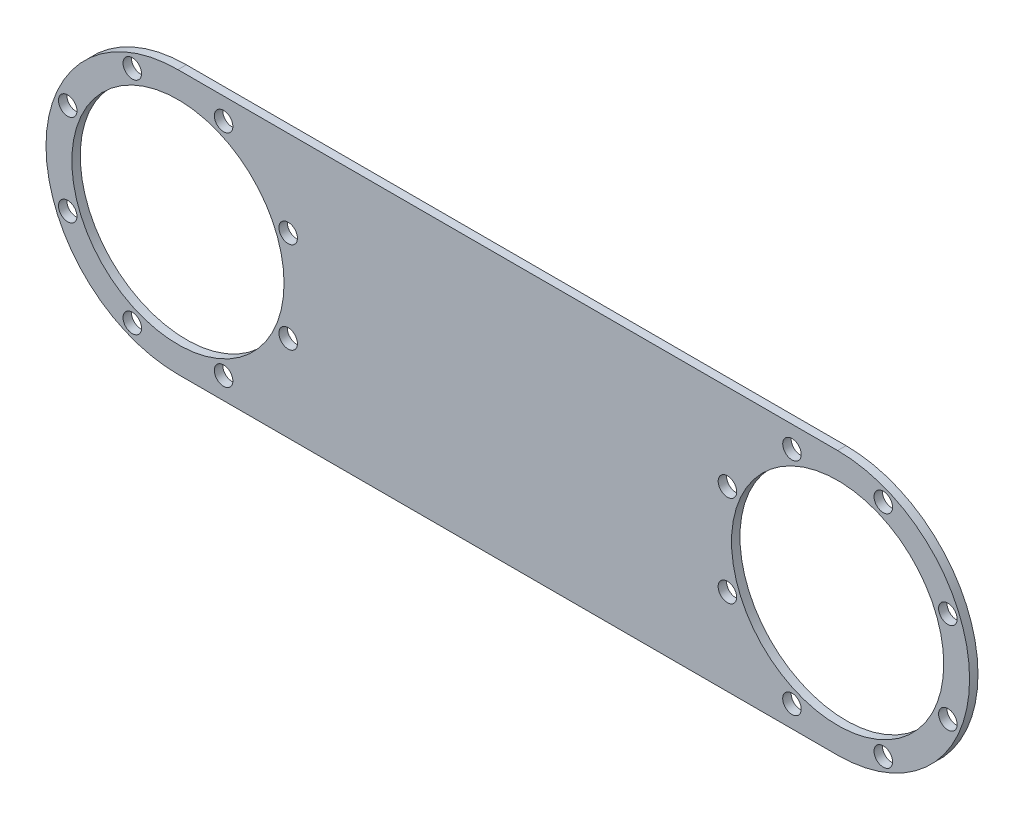
ISO-10303-21;
HEADER;
FILE_DESCRIPTION(('STEP AP214'),'2;1');
FILE_NAME('part.step','',(''),(''),'','','');
FILE_SCHEMA(('AUTOMOTIVE_DESIGN { 1 0 10303 214 1 1 1 1 }'));
ENDSEC;
DATA;
#1=APPLICATION_CONTEXT('core data for automotive mechanical design processes');
#2=APPLICATION_PROTOCOL_DEFINITION('international standard','automotive_design',2000,#1);
#3=PRODUCT_CONTEXT('',#1,'mechanical');
#4=PRODUCT('Part','Part','',(#3));
#5=PRODUCT_RELATED_PRODUCT_CATEGORY('part','',(#4));
#6=PRODUCT_DEFINITION_FORMATION('','',#4);
#7=PRODUCT_DEFINITION_CONTEXT('part definition',#1,'design');
#8=PRODUCT_DEFINITION('design','',#6,#7);
#9=PRODUCT_DEFINITION_SHAPE('','',#8);
#10=(LENGTH_UNIT() NAMED_UNIT(*) SI_UNIT(.MILLI.,.METRE.));
#11=(NAMED_UNIT(*) PLANE_ANGLE_UNIT() SI_UNIT($,.RADIAN.));
#12=(NAMED_UNIT(*) SI_UNIT($,.STERADIAN.) SOLID_ANGLE_UNIT());
#13=UNCERTAINTY_MEASURE_WITH_UNIT(LENGTH_MEASURE(1.E-05),#10,'distance_accuracy_value','');
#14=(GEOMETRIC_REPRESENTATION_CONTEXT(3) GLOBAL_UNCERTAINTY_ASSIGNED_CONTEXT((#13)) GLOBAL_UNIT_ASSIGNED_CONTEXT((#10,
#11,#12)) REPRESENTATION_CONTEXT('',''));
#15=CARTESIAN_POINT('',(0.,0.,0.));
#16=DIRECTION('',(0.,0.,1.));
#17=DIRECTION('',(1.,0.,0.));
#18=AXIS2_PLACEMENT_3D('',#15,#16,#17);
#19=CARTESIAN_POINT('',(0.,0.,3.));
#20=DIRECTION('',(0.,0.,-1.));
#21=DIRECTION('',(-1.,0.,0.));
#22=AXIS2_PLACEMENT_3D('',#19,#20,#21);
#23=PLANE('',#22);
#24=CARTESIAN_POINT('',(0.,0.,3.));
#25=DIRECTION('',(0.,0.,1.));
#26=DIRECTION('',(-1.,0.,0.));
#27=AXIS2_PLACEMENT_3D('',#24,#25,#26);
#28=CIRCLE('',#27,47.);
#29=CARTESIAN_POINT('',(0.,47.,3.));
#30=VERTEX_POINT('',#29);
#31=CARTESIAN_POINT('',(0.,-47.,3.));
#32=VERTEX_POINT('',#31);
#33=EDGE_CURVE('E87',#30,#32,#28,.T.);
#34=ORIENTED_EDGE('',*,*,#33,.T.);
#35=DIRECTION('',(1.,0.,0.));
#36=VECTOR('',#35,1.);
#37=CARTESIAN_POINT('',(0.,-47.,3.));
#38=LINE('',#37,#36);
#39=CARTESIAN_POINT('',(235.,-46.9999999999999,3.));
#40=VERTEX_POINT('',#39);
#41=EDGE_CURVE('E82',#32,#40,#38,.T.);
#42=ORIENTED_EDGE('',*,*,#41,.T.);
#43=CARTESIAN_POINT('',(235.,-1.55431223447522E-12,3.));
#44=DIRECTION('',(0.,0.,1.));
#45=DIRECTION('',(1.,0.,0.));
#46=AXIS2_PLACEMENT_3D('',#43,#44,#45);
#47=CIRCLE('',#46,47.);
#48=CARTESIAN_POINT('',(235.,46.9999999999984,3.));
#49=VERTEX_POINT('',#48);
#50=EDGE_CURVE('E85',#40,#49,#47,.T.);
#51=ORIENTED_EDGE('',*,*,#50,.T.);
#52=DIRECTION('',(-1.,0.,0.));
#53=VECTOR('',#52,1.);
#54=CARTESIAN_POINT('',(0.,47.,3.));
#55=LINE('',#54,#53);
#56=EDGE_CURVE('E52',#49,#30,#55,.T.);
#57=ORIENTED_EDGE('',*,*,#56,.T.);
#58=EDGE_LOOP('',(#34,#42,#51,#57));
#59=FACE_BOUND('',#58,.T.);
#60=CARTESIAN_POINT('',(0.,0.,3.));
#61=DIRECTION('',(0.,0.,1.));
#62=DIRECTION('',(1.,0.,0.));
#63=AXIS2_PLACEMENT_3D('',#60,#61,#62);
#64=CIRCLE('',#63,37.8);
#65=CARTESIAN_POINT('',(37.8,0.,3.));
#66=VERTEX_POINT('',#65);
#67=EDGE_CURVE('E102',#66,#66,#64,.T.);
#68=ORIENTED_EDGE('',*,*,#67,.F.);
#69=EDGE_LOOP('',(#68));
#70=FACE_BOUND('',#69,.T.);
#71=CARTESIAN_POINT('',(235.,-1.55431223447522E-12,3.));
#72=DIRECTION('',(0.,0.,1.));
#73=DIRECTION('',(1.,0.,0.));
#74=AXIS2_PLACEMENT_3D('',#71,#72,#73);
#75=CIRCLE('',#74,37.8);
#76=CARTESIAN_POINT('',(272.8,-1.55431223447522E-12,3.));
#77=VERTEX_POINT('',#76);
#78=EDGE_CURVE('E117',#77,#77,#75,.T.);
#79=ORIENTED_EDGE('',*,*,#78,.F.);
#80=EDGE_LOOP('',(#79));
#81=FACE_BOUND('',#80,.T.);
#82=CARTESIAN_POINT('',(16.2640458755164,-39.2648801317297,3.));
#83=DIRECTION('',(0.,0.,1.));
#84=DIRECTION('',(1.,0.,0.));
#85=AXIS2_PLACEMENT_3D('',#82,#83,#84);
#86=CIRCLE('',#85,3.30000000000001);
#87=CARTESIAN_POINT('',(19.5640458755164,-39.2648801317297,3.));
#88=VERTEX_POINT('',#87);
#89=EDGE_CURVE('E123',#88,#88,#86,.T.);
#90=ORIENTED_EDGE('',*,*,#89,.F.);
#91=EDGE_LOOP('',(#90));
#92=FACE_BOUND('',#91,.T.);
#93=CARTESIAN_POINT('',(39.2648801317298,-16.2640458755163,3.));
#94=DIRECTION('',(0.,0.,1.));
#95=DIRECTION('',(1.,0.,0.));
#96=AXIS2_PLACEMENT_3D('',#93,#94,#95);
#97=CIRCLE('',#96,3.3);
#98=CARTESIAN_POINT('',(42.5648801317298,-16.2640458755163,3.));
#99=VERTEX_POINT('',#98);
#100=EDGE_CURVE('E129',#99,#99,#97,.T.);
#101=ORIENTED_EDGE('',*,*,#100,.F.);
#102=EDGE_LOOP('',(#101));
#103=FACE_BOUND('',#102,.T.);
#104=CARTESIAN_POINT('',(39.2648801317297,16.2640458755163,3.));
#105=DIRECTION('',(0.,0.,1.));
#106=DIRECTION('',(1.,0.,0.));
#107=AXIS2_PLACEMENT_3D('',#104,#105,#106);
#108=CIRCLE('',#107,3.3);
#109=CARTESIAN_POINT('',(42.5648801317297,16.2640458755163,3.));
#110=VERTEX_POINT('',#109);
#111=EDGE_CURVE('E135',#110,#110,#108,.T.);
#112=ORIENTED_EDGE('',*,*,#111,.F.);
#113=EDGE_LOOP('',(#112));
#114=FACE_BOUND('',#113,.T.);
#115=CARTESIAN_POINT('',(16.2640458755164,39.2648801317297,3.));
#116=DIRECTION('',(0.,0.,1.));
#117=DIRECTION('',(1.,0.,0.));
#118=AXIS2_PLACEMENT_3D('',#115,#116,#117);
#119=CIRCLE('',#118,3.30000000000001);
#120=CARTESIAN_POINT('',(19.5640458755164,39.2648801317297,3.));
#121=VERTEX_POINT('',#120);
#122=EDGE_CURVE('E141',#121,#121,#119,.T.);
#123=ORIENTED_EDGE('',*,*,#122,.F.);
#124=EDGE_LOOP('',(#123));
#125=FACE_BOUND('',#124,.T.);
#126=CARTESIAN_POINT('',(-16.2640458755163,39.2648801317297,3.));
#127=DIRECTION('',(0.,0.,1.));
#128=DIRECTION('',(1.,0.,0.));
#129=AXIS2_PLACEMENT_3D('',#126,#127,#128);
#130=CIRCLE('',#129,3.3);
#131=CARTESIAN_POINT('',(-12.9640458755163,39.2648801317297,3.));
#132=VERTEX_POINT('',#131);
#133=EDGE_CURVE('E147',#132,#132,#130,.T.);
#134=ORIENTED_EDGE('',*,*,#133,.F.);
#135=EDGE_LOOP('',(#134));
#136=FACE_BOUND('',#135,.T.);
#137=CARTESIAN_POINT('',(-39.2648801317296,16.2640458755163,3.));
#138=DIRECTION('',(0.,0.,1.));
#139=DIRECTION('',(1.,0.,0.));
#140=AXIS2_PLACEMENT_3D('',#137,#138,#139);
#141=CIRCLE('',#140,3.3);
#142=CARTESIAN_POINT('',(-35.9648801317296,16.2640458755163,3.));
#143=VERTEX_POINT('',#142);
#144=EDGE_CURVE('E153',#143,#143,#141,.T.);
#145=ORIENTED_EDGE('',*,*,#144,.F.);
#146=EDGE_LOOP('',(#145));
#147=FACE_BOUND('',#146,.T.);
#148=CARTESIAN_POINT('',(-39.2648801317296,-16.2640458755163,3.));
#149=DIRECTION('',(0.,0.,1.));
#150=DIRECTION('',(1.,0.,0.));
#151=AXIS2_PLACEMENT_3D('',#148,#149,#150);
#152=CIRCLE('',#151,3.3);
#153=CARTESIAN_POINT('',(-35.9648801317296,-16.2640458755163,3.));
#154=VERTEX_POINT('',#153);
#155=EDGE_CURVE('E159',#154,#154,#152,.T.);
#156=ORIENTED_EDGE('',*,*,#155,.F.);
#157=EDGE_LOOP('',(#156));
#158=FACE_BOUND('',#157,.T.);
#159=CARTESIAN_POINT('',(-16.2640458755163,-39.2648801317297,3.));
#160=DIRECTION('',(0.,0.,1.));
#161=DIRECTION('',(1.,0.,0.));
#162=AXIS2_PLACEMENT_3D('',#159,#160,#161);
#163=CIRCLE('',#162,3.3);
#164=CARTESIAN_POINT('',(-12.9640458755163,-39.2648801317297,3.));
#165=VERTEX_POINT('',#164);
#166=EDGE_CURVE('E165',#165,#165,#163,.T.);
#167=ORIENTED_EDGE('',*,*,#166,.F.);
#168=EDGE_LOOP('',(#167));
#169=FACE_BOUND('',#168,.T.);
#170=CARTESIAN_POINT('',(251.264045875516,-39.2648801317296,3.));
#171=DIRECTION('',(0.,0.,1.));
#172=DIRECTION('',(1.,0.,0.));
#173=AXIS2_PLACEMENT_3D('',#170,#171,#172);
#174=CIRCLE('',#173,3.29999999999997);
#175=CARTESIAN_POINT('',(254.564045875516,-39.2648801317296,3.));
#176=VERTEX_POINT('',#175);
#177=EDGE_CURVE('E171',#176,#176,#174,.T.);
#178=ORIENTED_EDGE('',*,*,#177,.F.);
#179=EDGE_LOOP('',(#178));
#180=FACE_BOUND('',#179,.T.);
#181=CARTESIAN_POINT('',(274.26488013173,-16.2640458755163,3.));
#182=DIRECTION('',(0.,0.,1.));
#183=DIRECTION('',(1.,0.,0.));
#184=AXIS2_PLACEMENT_3D('',#181,#182,#183);
#185=CIRCLE('',#184,3.29999999999998);
#186=CARTESIAN_POINT('',(277.56488013173,-16.2640458755163,3.));
#187=VERTEX_POINT('',#186);
#188=EDGE_CURVE('E177',#187,#187,#185,.T.);
#189=ORIENTED_EDGE('',*,*,#188,.F.);
#190=EDGE_LOOP('',(#189));
#191=FACE_BOUND('',#190,.T.);
#192=CARTESIAN_POINT('',(274.26488013173,16.2640458755164,3.));
#193=DIRECTION('',(0.,0.,1.));
#194=DIRECTION('',(1.,0.,0.));
#195=AXIS2_PLACEMENT_3D('',#192,#193,#194);
#196=CIRCLE('',#195,3.29999999999997);
#197=CARTESIAN_POINT('',(277.56488013173,16.2640458755164,3.));
#198=VERTEX_POINT('',#197);
#199=EDGE_CURVE('E183',#198,#198,#196,.T.);
#200=ORIENTED_EDGE('',*,*,#199,.F.);
#201=EDGE_LOOP('',(#200));
#202=FACE_BOUND('',#201,.T.);
#203=CARTESIAN_POINT('',(251.264045875516,39.2648801317297,3.));
#204=DIRECTION('',(0.,0.,1.));
#205=DIRECTION('',(1.,0.,0.));
#206=AXIS2_PLACEMENT_3D('',#203,#204,#205);
#207=CIRCLE('',#206,3.29999999999997);
#208=CARTESIAN_POINT('',(254.564045875516,39.2648801317297,3.));
#209=VERTEX_POINT('',#208);
#210=EDGE_CURVE('E189',#209,#209,#207,.T.);
#211=ORIENTED_EDGE('',*,*,#210,.F.);
#212=EDGE_LOOP('',(#211));
#213=FACE_BOUND('',#212,.T.);
#214=CARTESIAN_POINT('',(218.735954124484,39.2648801317297,3.));
#215=DIRECTION('',(0.,0.,1.));
#216=DIRECTION('',(1.,0.,0.));
#217=AXIS2_PLACEMENT_3D('',#214,#215,#216);
#218=CIRCLE('',#217,3.3);
#219=CARTESIAN_POINT('',(222.035954124484,39.2648801317297,3.));
#220=VERTEX_POINT('',#219);
#221=EDGE_CURVE('E195',#220,#220,#218,.T.);
#222=ORIENTED_EDGE('',*,*,#221,.F.);
#223=EDGE_LOOP('',(#222));
#224=FACE_BOUND('',#223,.T.);
#225=CARTESIAN_POINT('',(195.73511986827,16.2640458755164,3.));
#226=DIRECTION('',(0.,0.,1.));
#227=DIRECTION('',(1.,0.,0.));
#228=AXIS2_PLACEMENT_3D('',#225,#226,#227);
#229=CIRCLE('',#228,3.3);
#230=CARTESIAN_POINT('',(199.03511986827,16.2640458755164,3.));
#231=VERTEX_POINT('',#230);
#232=EDGE_CURVE('E201',#231,#231,#229,.T.);
#233=ORIENTED_EDGE('',*,*,#232,.F.);
#234=EDGE_LOOP('',(#233));
#235=FACE_BOUND('',#234,.T.);
#236=CARTESIAN_POINT('',(195.73511986827,-16.2640458755163,3.));
#237=DIRECTION('',(0.,0.,1.));
#238=DIRECTION('',(1.,0.,0.));
#239=AXIS2_PLACEMENT_3D('',#236,#237,#238);
#240=CIRCLE('',#239,3.3);
#241=CARTESIAN_POINT('',(199.03511986827,-16.2640458755163,3.));
#242=VERTEX_POINT('',#241);
#243=EDGE_CURVE('E207',#242,#242,#240,.T.);
#244=ORIENTED_EDGE('',*,*,#243,.F.);
#245=EDGE_LOOP('',(#244));
#246=FACE_BOUND('',#245,.T.);
#247=CARTESIAN_POINT('',(218.735954124484,-39.2648801317296,3.));
#248=DIRECTION('',(0.,0.,1.));
#249=DIRECTION('',(1.,0.,0.));
#250=AXIS2_PLACEMENT_3D('',#247,#248,#249);
#251=CIRCLE('',#250,3.3);
#252=CARTESIAN_POINT('',(222.035954124484,-39.2648801317296,3.));
#253=VERTEX_POINT('',#252);
#254=EDGE_CURVE('E213',#253,#253,#251,.T.);
#255=ORIENTED_EDGE('',*,*,#254,.F.);
#256=EDGE_LOOP('',(#255));
#257=FACE_BOUND('',#256,.T.);
#258=ADVANCED_FACE('F35',(#59,#70,#81,#92,#103,#114,#125,#136,#147,#158,#169,#180,#191,#202,
#213,#224,#235,#246,#257),#23,.F.);
#259=CARTESIAN_POINT('',(0.,0.,0.));
#260=DIRECTION('',(0.,0.,-1.));
#261=DIRECTION('',(-1.,0.,0.));
#262=AXIS2_PLACEMENT_3D('',#259,#260,#261);
#263=PLANE('',#262);
#264=CARTESIAN_POINT('',(195.73511986827,-16.2640458755163,0.));
#265=DIRECTION('',(0.,0.,1.));
#266=DIRECTION('',(1.,0.,0.));
#267=AXIS2_PLACEMENT_3D('',#264,#265,#266);
#268=CIRCLE('',#267,3.3);
#269=CARTESIAN_POINT('',(199.03511986827,-16.2640458755163,0.));
#270=VERTEX_POINT('',#269);
#271=EDGE_CURVE('E210',#270,#270,#268,.T.);
#272=ORIENTED_EDGE('',*,*,#271,.T.);
#273=EDGE_LOOP('',(#272));
#274=FACE_BOUND('',#273,.T.);
#275=CARTESIAN_POINT('',(218.735954124484,39.2648801317297,0.));
#276=DIRECTION('',(0.,0.,1.));
#277=DIRECTION('',(1.,0.,0.));
#278=AXIS2_PLACEMENT_3D('',#275,#276,#277);
#279=CIRCLE('',#278,3.3);
#280=CARTESIAN_POINT('',(222.035954124484,39.2648801317297,0.));
#281=VERTEX_POINT('',#280);
#282=EDGE_CURVE('E198',#281,#281,#279,.T.);
#283=ORIENTED_EDGE('',*,*,#282,.T.);
#284=EDGE_LOOP('',(#283));
#285=FACE_BOUND('',#284,.T.);
#286=CARTESIAN_POINT('',(274.26488013173,16.2640458755164,0.));
#287=DIRECTION('',(0.,0.,1.));
#288=DIRECTION('',(1.,0.,0.));
#289=AXIS2_PLACEMENT_3D('',#286,#287,#288);
#290=CIRCLE('',#289,3.29999999999997);
#291=CARTESIAN_POINT('',(277.56488013173,16.2640458755164,0.));
#292=VERTEX_POINT('',#291);
#293=EDGE_CURVE('E186',#292,#292,#290,.T.);
#294=ORIENTED_EDGE('',*,*,#293,.T.);
#295=EDGE_LOOP('',(#294));
#296=FACE_BOUND('',#295,.T.);
#297=CARTESIAN_POINT('',(251.264045875516,-39.2648801317296,0.));
#298=DIRECTION('',(0.,0.,1.));
#299=DIRECTION('',(1.,0.,0.));
#300=AXIS2_PLACEMENT_3D('',#297,#298,#299);
#301=CIRCLE('',#300,3.29999999999997);
#302=CARTESIAN_POINT('',(254.564045875516,-39.2648801317296,0.));
#303=VERTEX_POINT('',#302);
#304=EDGE_CURVE('E174',#303,#303,#301,.T.);
#305=ORIENTED_EDGE('',*,*,#304,.T.);
#306=EDGE_LOOP('',(#305));
#307=FACE_BOUND('',#306,.T.);
#308=CARTESIAN_POINT('',(-39.2648801317296,-16.2640458755163,0.));
#309=DIRECTION('',(0.,0.,1.));
#310=DIRECTION('',(1.,0.,0.));
#311=AXIS2_PLACEMENT_3D('',#308,#309,#310);
#312=CIRCLE('',#311,3.3);
#313=CARTESIAN_POINT('',(-35.9648801317296,-16.2640458755163,0.));
#314=VERTEX_POINT('',#313);
#315=EDGE_CURVE('E162',#314,#314,#312,.T.);
#316=ORIENTED_EDGE('',*,*,#315,.T.);
#317=EDGE_LOOP('',(#316));
#318=FACE_BOUND('',#317,.T.);
#319=CARTESIAN_POINT('',(-16.2640458755163,39.2648801317297,0.));
#320=DIRECTION('',(0.,0.,1.));
#321=DIRECTION('',(1.,0.,0.));
#322=AXIS2_PLACEMENT_3D('',#319,#320,#321);
#323=CIRCLE('',#322,3.3);
#324=CARTESIAN_POINT('',(-12.9640458755163,39.2648801317297,0.));
#325=VERTEX_POINT('',#324);
#326=EDGE_CURVE('E150',#325,#325,#323,.T.);
#327=ORIENTED_EDGE('',*,*,#326,.T.);
#328=EDGE_LOOP('',(#327));
#329=FACE_BOUND('',#328,.T.);
#330=CARTESIAN_POINT('',(39.2648801317297,16.2640458755163,0.));
#331=DIRECTION('',(0.,0.,1.));
#332=DIRECTION('',(1.,0.,0.));
#333=AXIS2_PLACEMENT_3D('',#330,#331,#332);
#334=CIRCLE('',#333,3.3);
#335=CARTESIAN_POINT('',(42.5648801317297,16.2640458755163,0.));
#336=VERTEX_POINT('',#335);
#337=EDGE_CURVE('E138',#336,#336,#334,.T.);
#338=ORIENTED_EDGE('',*,*,#337,.T.);
#339=EDGE_LOOP('',(#338));
#340=FACE_BOUND('',#339,.T.);
#341=CARTESIAN_POINT('',(16.2640458755164,-39.2648801317297,0.));
#342=DIRECTION('',(0.,0.,1.));
#343=DIRECTION('',(1.,0.,0.));
#344=AXIS2_PLACEMENT_3D('',#341,#342,#343);
#345=CIRCLE('',#344,3.30000000000001);
#346=CARTESIAN_POINT('',(19.5640458755164,-39.2648801317297,0.));
#347=VERTEX_POINT('',#346);
#348=EDGE_CURVE('E126',#347,#347,#345,.T.);
#349=ORIENTED_EDGE('',*,*,#348,.T.);
#350=EDGE_LOOP('',(#349));
#351=FACE_BOUND('',#350,.T.);
#352=CARTESIAN_POINT('',(0.,0.,0.));
#353=DIRECTION('',(0.,0.,1.));
#354=DIRECTION('',(1.,0.,0.));
#355=AXIS2_PLACEMENT_3D('',#352,#353,#354);
#356=CIRCLE('',#355,37.8);
#357=CARTESIAN_POINT('',(37.8,0.,0.));
#358=VERTEX_POINT('',#357);
#359=EDGE_CURVE('E114',#358,#358,#356,.T.);
#360=ORIENTED_EDGE('',*,*,#359,.T.);
#361=EDGE_LOOP('',(#360));
#362=FACE_BOUND('',#361,.T.);
#363=CARTESIAN_POINT('',(0.,0.,0.));
#364=DIRECTION('',(0.,0.,1.));
#365=DIRECTION('',(-1.,0.,0.));
#366=AXIS2_PLACEMENT_3D('',#363,#364,#365);
#367=CIRCLE('',#366,47.);
#368=CARTESIAN_POINT('',(0.,47.,0.));
#369=VERTEX_POINT('',#368);
#370=CARTESIAN_POINT('',(0.,-47.,0.));
#371=VERTEX_POINT('',#370);
#372=EDGE_CURVE('E99',#369,#371,#367,.T.);
#373=ORIENTED_EDGE('',*,*,#372,.F.);
#374=DIRECTION('',(-1.,0.,0.));
#375=VECTOR('',#374,1.);
#376=CARTESIAN_POINT('',(0.,47.,0.));
#377=LINE('',#376,#375);
#378=CARTESIAN_POINT('',(235.,46.9999999999984,0.));
#379=VERTEX_POINT('',#378);
#380=EDGE_CURVE('E75',#379,#369,#377,.T.);
#381=ORIENTED_EDGE('',*,*,#380,.F.);
#382=CARTESIAN_POINT('',(235.,-1.55431223447522E-12,0.));
#383=DIRECTION('',(0.,0.,1.));
#384=DIRECTION('',(1.,0.,0.));
#385=AXIS2_PLACEMENT_3D('',#382,#383,#384);
#386=CIRCLE('',#385,47.);
#387=CARTESIAN_POINT('',(235.,-46.9999999999999,0.));
#388=VERTEX_POINT('',#387);
#389=EDGE_CURVE('E69',#388,#379,#386,.T.);
#390=ORIENTED_EDGE('',*,*,#389,.F.);
#391=DIRECTION('',(1.,0.,0.));
#392=VECTOR('',#391,1.);
#393=CARTESIAN_POINT('',(0.,-47.,0.));
#394=LINE('',#393,#392);
#395=EDGE_CURVE('E91',#371,#388,#394,.T.);
#396=ORIENTED_EDGE('',*,*,#395,.F.);
#397=EDGE_LOOP('',(#373,#381,#390,#396));
#398=FACE_BOUND('',#397,.T.);
#399=CARTESIAN_POINT('',(235.,-1.55431223447522E-12,0.));
#400=DIRECTION('',(0.,0.,1.));
#401=DIRECTION('',(1.,0.,0.));
#402=AXIS2_PLACEMENT_3D('',#399,#400,#401);
#403=CIRCLE('',#402,37.8);
#404=CARTESIAN_POINT('',(272.8,-1.55431223447522E-12,0.));
#405=VERTEX_POINT('',#404);
#406=EDGE_CURVE('E120',#405,#405,#403,.T.);
#407=ORIENTED_EDGE('',*,*,#406,.T.);
#408=EDGE_LOOP('',(#407));
#409=FACE_BOUND('',#408,.T.);
#410=CARTESIAN_POINT('',(39.2648801317298,-16.2640458755163,0.));
#411=DIRECTION('',(0.,0.,1.));
#412=DIRECTION('',(1.,0.,0.));
#413=AXIS2_PLACEMENT_3D('',#410,#411,#412);
#414=CIRCLE('',#413,3.3);
#415=CARTESIAN_POINT('',(42.5648801317298,-16.2640458755163,0.));
#416=VERTEX_POINT('',#415);
#417=EDGE_CURVE('E132',#416,#416,#414,.T.);
#418=ORIENTED_EDGE('',*,*,#417,.T.);
#419=EDGE_LOOP('',(#418));
#420=FACE_BOUND('',#419,.T.);
#421=CARTESIAN_POINT('',(16.2640458755164,39.2648801317297,0.));
#422=DIRECTION('',(0.,0.,1.));
#423=DIRECTION('',(1.,0.,0.));
#424=AXIS2_PLACEMENT_3D('',#421,#422,#423);
#425=CIRCLE('',#424,3.30000000000001);
#426=CARTESIAN_POINT('',(19.5640458755164,39.2648801317297,0.));
#427=VERTEX_POINT('',#426);
#428=EDGE_CURVE('E144',#427,#427,#425,.T.);
#429=ORIENTED_EDGE('',*,*,#428,.T.);
#430=EDGE_LOOP('',(#429));
#431=FACE_BOUND('',#430,.T.);
#432=CARTESIAN_POINT('',(-39.2648801317296,16.2640458755163,0.));
#433=DIRECTION('',(0.,0.,1.));
#434=DIRECTION('',(1.,0.,0.));
#435=AXIS2_PLACEMENT_3D('',#432,#433,#434);
#436=CIRCLE('',#435,3.3);
#437=CARTESIAN_POINT('',(-35.9648801317296,16.2640458755163,0.));
#438=VERTEX_POINT('',#437);
#439=EDGE_CURVE('E156',#438,#438,#436,.T.);
#440=ORIENTED_EDGE('',*,*,#439,.T.);
#441=EDGE_LOOP('',(#440));
#442=FACE_BOUND('',#441,.T.);
#443=CARTESIAN_POINT('',(-16.2640458755163,-39.2648801317297,0.));
#444=DIRECTION('',(0.,0.,1.));
#445=DIRECTION('',(1.,0.,0.));
#446=AXIS2_PLACEMENT_3D('',#443,#444,#445);
#447=CIRCLE('',#446,3.3);
#448=CARTESIAN_POINT('',(-12.9640458755163,-39.2648801317297,0.));
#449=VERTEX_POINT('',#448);
#450=EDGE_CURVE('E168',#449,#449,#447,.T.);
#451=ORIENTED_EDGE('',*,*,#450,.T.);
#452=EDGE_LOOP('',(#451));
#453=FACE_BOUND('',#452,.T.);
#454=CARTESIAN_POINT('',(274.26488013173,-16.2640458755163,0.));
#455=DIRECTION('',(0.,0.,1.));
#456=DIRECTION('',(1.,0.,0.));
#457=AXIS2_PLACEMENT_3D('',#454,#455,#456);
#458=CIRCLE('',#457,3.29999999999998);
#459=CARTESIAN_POINT('',(277.56488013173,-16.2640458755163,0.));
#460=VERTEX_POINT('',#459);
#461=EDGE_CURVE('E180',#460,#460,#458,.T.);
#462=ORIENTED_EDGE('',*,*,#461,.T.);
#463=EDGE_LOOP('',(#462));
#464=FACE_BOUND('',#463,.T.);
#465=CARTESIAN_POINT('',(251.264045875516,39.2648801317297,0.));
#466=DIRECTION('',(0.,0.,1.));
#467=DIRECTION('',(1.,0.,0.));
#468=AXIS2_PLACEMENT_3D('',#465,#466,#467);
#469=CIRCLE('',#468,3.29999999999997);
#470=CARTESIAN_POINT('',(254.564045875516,39.2648801317297,0.));
#471=VERTEX_POINT('',#470);
#472=EDGE_CURVE('E192',#471,#471,#469,.T.);
#473=ORIENTED_EDGE('',*,*,#472,.T.);
#474=EDGE_LOOP('',(#473));
#475=FACE_BOUND('',#474,.T.);
#476=CARTESIAN_POINT('',(195.73511986827,16.2640458755164,0.));
#477=DIRECTION('',(0.,0.,1.));
#478=DIRECTION('',(1.,0.,0.));
#479=AXIS2_PLACEMENT_3D('',#476,#477,#478);
#480=CIRCLE('',#479,3.3);
#481=CARTESIAN_POINT('',(199.03511986827,16.2640458755164,0.));
#482=VERTEX_POINT('',#481);
#483=EDGE_CURVE('E204',#482,#482,#480,.T.);
#484=ORIENTED_EDGE('',*,*,#483,.T.);
#485=EDGE_LOOP('',(#484));
#486=FACE_BOUND('',#485,.T.);
#487=CARTESIAN_POINT('',(218.735954124484,-39.2648801317296,0.));
#488=DIRECTION('',(0.,0.,1.));
#489=DIRECTION('',(1.,0.,0.));
#490=AXIS2_PLACEMENT_3D('',#487,#488,#489);
#491=CIRCLE('',#490,3.3);
#492=CARTESIAN_POINT('',(222.035954124484,-39.2648801317296,0.));
#493=VERTEX_POINT('',#492);
#494=EDGE_CURVE('E216',#493,#493,#491,.T.);
#495=ORIENTED_EDGE('',*,*,#494,.T.);
#496=EDGE_LOOP('',(#495));
#497=FACE_BOUND('',#496,.T.);
#498=ADVANCED_FACE('F110',(#274,#285,#296,#307,#318,#329,#340,#351,#362,#398,#409,#420,#431,
#442,#453,#464,#475,#486,#497),#263,.T.);
#499=CARTESIAN_POINT('',(0.,0.,3.));
#500=DIRECTION('',(0.,0.,-1.));
#501=DIRECTION('',(-1.,0.,0.));
#502=AXIS2_PLACEMENT_3D('',#499,#500,#501);
#503=CYLINDRICAL_SURFACE('',#502,47.);
#504=ORIENTED_EDGE('',*,*,#372,.T.);
#505=DIRECTION('',(0.,0.,-1.));
#506=VECTOR('',#505,1.);
#507=CARTESIAN_POINT('',(0.,-47.,3.));
#508=LINE('',#507,#506);
#509=EDGE_CURVE('E11',#32,#371,#508,.T.);
#510=ORIENTED_EDGE('',*,*,#509,.F.);
#511=ORIENTED_EDGE('',*,*,#33,.F.);
#512=DIRECTION('',(0.,0.,-1.));
#513=VECTOR('',#512,1.);
#514=CARTESIAN_POINT('',(0.,47.,3.));
#515=LINE('',#514,#513);
#516=EDGE_CURVE('E95',#30,#369,#515,.T.);
#517=ORIENTED_EDGE('',*,*,#516,.T.);
#518=EDGE_LOOP('',(#504,#510,#511,#517));
#519=FACE_BOUND('',#518,.T.);
#520=ADVANCED_FACE('F37',(#519),#503,.T.);
#521=CARTESIAN_POINT('',(0.,-47.,3.));
#522=DIRECTION('',(0.,1.,0.));
#523=DIRECTION('',(-1.,0.,0.));
#524=AXIS2_PLACEMENT_3D('',#521,#522,#523);
#525=PLANE('',#524);
#526=ORIENTED_EDGE('',*,*,#395,.T.);
#527=DIRECTION('',(0.,0.,-1.));
#528=VECTOR('',#527,1.);
#529=CARTESIAN_POINT('',(235.,-46.9999999999999,3.));
#530=LINE('',#529,#528);
#531=EDGE_CURVE('E44',#40,#388,#530,.T.);
#532=ORIENTED_EDGE('',*,*,#531,.F.);
#533=ORIENTED_EDGE('',*,*,#41,.F.);
#534=ORIENTED_EDGE('',*,*,#509,.T.);
#535=EDGE_LOOP('',(#526,#532,#533,#534));
#536=FACE_BOUND('',#535,.T.);
#537=ADVANCED_FACE('F90',(#536),#525,.F.);
#538=CARTESIAN_POINT('',(235.,-1.55431223447522E-12,3.));
#539=DIRECTION('',(0.,0.,-1.));
#540=DIRECTION('',(-1.,0.,0.));
#541=AXIS2_PLACEMENT_3D('',#538,#539,#540);
#542=CYLINDRICAL_SURFACE('',#541,47.);
#543=ORIENTED_EDGE('',*,*,#389,.T.);
#544=DIRECTION('',(0.,0.,-1.));
#545=VECTOR('',#544,1.);
#546=CARTESIAN_POINT('',(235.,46.9999999999984,3.));
#547=LINE('',#546,#545);
#548=EDGE_CURVE('E92',#49,#379,#547,.T.);
#549=ORIENTED_EDGE('',*,*,#548,.F.);
#550=ORIENTED_EDGE('',*,*,#50,.F.);
#551=ORIENTED_EDGE('',*,*,#531,.T.);
#552=EDGE_LOOP('',(#543,#549,#550,#551));
#553=FACE_BOUND('',#552,.T.);
#554=ADVANCED_FACE('F93',(#553),#542,.T.);
#555=CARTESIAN_POINT('',(0.,47.,3.));
#556=DIRECTION('',(0.,-1.,0.));
#557=DIRECTION('',(1.,0.,0.));
#558=AXIS2_PLACEMENT_3D('',#555,#556,#557);
#559=PLANE('',#558);
#560=ORIENTED_EDGE('',*,*,#380,.T.);
#561=ORIENTED_EDGE('',*,*,#516,.F.);
#562=ORIENTED_EDGE('',*,*,#56,.F.);
#563=ORIENTED_EDGE('',*,*,#548,.T.);
#564=EDGE_LOOP('',(#560,#561,#562,#563));
#565=FACE_BOUND('',#564,.T.);
#566=ADVANCED_FACE('F107',(#565),#559,.F.);
#567=CARTESIAN_POINT('',(0.,0.,3.));
#568=DIRECTION('',(0.,0.,-1.));
#569=DIRECTION('',(-1.,0.,0.));
#570=AXIS2_PLACEMENT_3D('',#567,#568,#569);
#571=CYLINDRICAL_SURFACE('',#570,37.8);
#572=ORIENTED_EDGE('',*,*,#67,.T.);
#573=EDGE_LOOP('',(#572));
#574=FACE_BOUND('',#573,.T.);
#575=ORIENTED_EDGE('',*,*,#359,.F.);
#576=EDGE_LOOP('',(#575));
#577=FACE_BOUND('',#576,.T.);
#578=ADVANCED_FACE('F233',(#574,#577),#571,.F.);
#579=CARTESIAN_POINT('',(235.,-1.55431223447522E-12,3.));
#580=DIRECTION('',(0.,0.,-1.));
#581=DIRECTION('',(-1.,0.,0.));
#582=AXIS2_PLACEMENT_3D('',#579,#580,#581);
#583=CYLINDRICAL_SURFACE('',#582,37.8);
#584=ORIENTED_EDGE('',*,*,#78,.T.);
#585=EDGE_LOOP('',(#584));
#586=FACE_BOUND('',#585,.T.);
#587=ORIENTED_EDGE('',*,*,#406,.F.);
#588=EDGE_LOOP('',(#587));
#589=FACE_BOUND('',#588,.T.);
#590=ADVANCED_FACE('F279',(#586,#589),#583,.F.);
#591=CARTESIAN_POINT('',(16.2640458755164,-39.2648801317297,3.));
#592=DIRECTION('',(0.,0.,-1.));
#593=DIRECTION('',(-1.,0.,0.));
#594=AXIS2_PLACEMENT_3D('',#591,#592,#593);
#595=CYLINDRICAL_SURFACE('',#594,3.30000000000001);
#596=ORIENTED_EDGE('',*,*,#89,.T.);
#597=EDGE_LOOP('',(#596));
#598=FACE_BOUND('',#597,.T.);
#599=ORIENTED_EDGE('',*,*,#348,.F.);
#600=EDGE_LOOP('',(#599));
#601=FACE_BOUND('',#600,.T.);
#602=ADVANCED_FACE('F287',(#598,#601),#595,.F.);
#603=CARTESIAN_POINT('',(39.2648801317298,-16.2640458755163,3.));
#604=DIRECTION('',(0.,0.,-1.));
#605=DIRECTION('',(-1.,0.,0.));
#606=AXIS2_PLACEMENT_3D('',#603,#604,#605);
#607=CYLINDRICAL_SURFACE('',#606,3.3);
#608=ORIENTED_EDGE('',*,*,#100,.T.);
#609=EDGE_LOOP('',(#608));
#610=FACE_BOUND('',#609,.T.);
#611=ORIENTED_EDGE('',*,*,#417,.F.);
#612=EDGE_LOOP('',(#611));
#613=FACE_BOUND('',#612,.T.);
#614=ADVANCED_FACE('F295',(#610,#613),#607,.F.);
#615=CARTESIAN_POINT('',(39.2648801317297,16.2640458755163,3.));
#616=DIRECTION('',(0.,0.,-1.));
#617=DIRECTION('',(-1.,0.,0.));
#618=AXIS2_PLACEMENT_3D('',#615,#616,#617);
#619=CYLINDRICAL_SURFACE('',#618,3.3);
#620=ORIENTED_EDGE('',*,*,#111,.T.);
#621=EDGE_LOOP('',(#620));
#622=FACE_BOUND('',#621,.T.);
#623=ORIENTED_EDGE('',*,*,#337,.F.);
#624=EDGE_LOOP('',(#623));
#625=FACE_BOUND('',#624,.T.);
#626=ADVANCED_FACE('F304',(#622,#625),#619,.F.);
#627=CARTESIAN_POINT('',(16.2640458755164,39.2648801317297,3.));
#628=DIRECTION('',(0.,0.,-1.));
#629=DIRECTION('',(-1.,0.,0.));
#630=AXIS2_PLACEMENT_3D('',#627,#628,#629);
#631=CYLINDRICAL_SURFACE('',#630,3.30000000000001);
#632=ORIENTED_EDGE('',*,*,#122,.T.);
#633=EDGE_LOOP('',(#632));
#634=FACE_BOUND('',#633,.T.);
#635=ORIENTED_EDGE('',*,*,#428,.F.);
#636=EDGE_LOOP('',(#635));
#637=FACE_BOUND('',#636,.T.);
#638=ADVANCED_FACE('F313',(#634,#637),#631,.F.);
#639=CARTESIAN_POINT('',(-16.2640458755163,39.2648801317297,3.));
#640=DIRECTION('',(0.,0.,-1.));
#641=DIRECTION('',(-1.,0.,0.));
#642=AXIS2_PLACEMENT_3D('',#639,#640,#641);
#643=CYLINDRICAL_SURFACE('',#642,3.3);
#644=ORIENTED_EDGE('',*,*,#133,.T.);
#645=EDGE_LOOP('',(#644));
#646=FACE_BOUND('',#645,.T.);
#647=ORIENTED_EDGE('',*,*,#326,.F.);
#648=EDGE_LOOP('',(#647));
#649=FACE_BOUND('',#648,.T.);
#650=ADVANCED_FACE('F322',(#646,#649),#643,.F.);
#651=CARTESIAN_POINT('',(-39.2648801317296,16.2640458755163,3.));
#652=DIRECTION('',(0.,0.,-1.));
#653=DIRECTION('',(-1.,0.,0.));
#654=AXIS2_PLACEMENT_3D('',#651,#652,#653);
#655=CYLINDRICAL_SURFACE('',#654,3.3);
#656=ORIENTED_EDGE('',*,*,#144,.T.);
#657=EDGE_LOOP('',(#656));
#658=FACE_BOUND('',#657,.T.);
#659=ORIENTED_EDGE('',*,*,#439,.F.);
#660=EDGE_LOOP('',(#659));
#661=FACE_BOUND('',#660,.T.);
#662=ADVANCED_FACE('F331',(#658,#661),#655,.F.);
#663=CARTESIAN_POINT('',(-39.2648801317296,-16.2640458755163,3.));
#664=DIRECTION('',(0.,0.,-1.));
#665=DIRECTION('',(-1.,0.,0.));
#666=AXIS2_PLACEMENT_3D('',#663,#664,#665);
#667=CYLINDRICAL_SURFACE('',#666,3.3);
#668=ORIENTED_EDGE('',*,*,#155,.T.);
#669=EDGE_LOOP('',(#668));
#670=FACE_BOUND('',#669,.T.);
#671=ORIENTED_EDGE('',*,*,#315,.F.);
#672=EDGE_LOOP('',(#671));
#673=FACE_BOUND('',#672,.T.);
#674=ADVANCED_FACE('F340',(#670,#673),#667,.F.);
#675=CARTESIAN_POINT('',(-16.2640458755163,-39.2648801317297,3.));
#676=DIRECTION('',(0.,0.,-1.));
#677=DIRECTION('',(-1.,0.,0.));
#678=AXIS2_PLACEMENT_3D('',#675,#676,#677);
#679=CYLINDRICAL_SURFACE('',#678,3.3);
#680=ORIENTED_EDGE('',*,*,#166,.T.);
#681=EDGE_LOOP('',(#680));
#682=FACE_BOUND('',#681,.T.);
#683=ORIENTED_EDGE('',*,*,#450,.F.);
#684=EDGE_LOOP('',(#683));
#685=FACE_BOUND('',#684,.T.);
#686=ADVANCED_FACE('F349',(#682,#685),#679,.F.);
#687=CARTESIAN_POINT('',(251.264045875516,-39.2648801317296,3.));
#688=DIRECTION('',(0.,0.,-1.));
#689=DIRECTION('',(-1.,0.,0.));
#690=AXIS2_PLACEMENT_3D('',#687,#688,#689);
#691=CYLINDRICAL_SURFACE('',#690,3.29999999999997);
#692=ORIENTED_EDGE('',*,*,#177,.T.);
#693=EDGE_LOOP('',(#692));
#694=FACE_BOUND('',#693,.T.);
#695=ORIENTED_EDGE('',*,*,#304,.F.);
#696=EDGE_LOOP('',(#695));
#697=FACE_BOUND('',#696,.T.);
#698=ADVANCED_FACE('F358',(#694,#697),#691,.F.);
#699=CARTESIAN_POINT('',(274.26488013173,-16.2640458755163,3.));
#700=DIRECTION('',(0.,0.,-1.));
#701=DIRECTION('',(-1.,0.,0.));
#702=AXIS2_PLACEMENT_3D('',#699,#700,#701);
#703=CYLINDRICAL_SURFACE('',#702,3.29999999999998);
#704=ORIENTED_EDGE('',*,*,#188,.T.);
#705=EDGE_LOOP('',(#704));
#706=FACE_BOUND('',#705,.T.);
#707=ORIENTED_EDGE('',*,*,#461,.F.);
#708=EDGE_LOOP('',(#707));
#709=FACE_BOUND('',#708,.T.);
#710=ADVANCED_FACE('F367',(#706,#709),#703,.F.);
#711=CARTESIAN_POINT('',(274.26488013173,16.2640458755164,3.));
#712=DIRECTION('',(0.,0.,-1.));
#713=DIRECTION('',(-1.,0.,0.));
#714=AXIS2_PLACEMENT_3D('',#711,#712,#713);
#715=CYLINDRICAL_SURFACE('',#714,3.29999999999997);
#716=ORIENTED_EDGE('',*,*,#199,.T.);
#717=EDGE_LOOP('',(#716));
#718=FACE_BOUND('',#717,.T.);
#719=ORIENTED_EDGE('',*,*,#293,.F.);
#720=EDGE_LOOP('',(#719));
#721=FACE_BOUND('',#720,.T.);
#722=ADVANCED_FACE('F376',(#718,#721),#715,.F.);
#723=CARTESIAN_POINT('',(251.264045875516,39.2648801317297,3.));
#724=DIRECTION('',(0.,0.,-1.));
#725=DIRECTION('',(-1.,0.,0.));
#726=AXIS2_PLACEMENT_3D('',#723,#724,#725);
#727=CYLINDRICAL_SURFACE('',#726,3.29999999999997);
#728=ORIENTED_EDGE('',*,*,#210,.T.);
#729=EDGE_LOOP('',(#728));
#730=FACE_BOUND('',#729,.T.);
#731=ORIENTED_EDGE('',*,*,#472,.F.);
#732=EDGE_LOOP('',(#731));
#733=FACE_BOUND('',#732,.T.);
#734=ADVANCED_FACE('F385',(#730,#733),#727,.F.);
#735=CARTESIAN_POINT('',(218.735954124484,39.2648801317297,3.));
#736=DIRECTION('',(0.,0.,-1.));
#737=DIRECTION('',(-1.,0.,0.));
#738=AXIS2_PLACEMENT_3D('',#735,#736,#737);
#739=CYLINDRICAL_SURFACE('',#738,3.3);
#740=ORIENTED_EDGE('',*,*,#221,.T.);
#741=EDGE_LOOP('',(#740));
#742=FACE_BOUND('',#741,.T.);
#743=ORIENTED_EDGE('',*,*,#282,.F.);
#744=EDGE_LOOP('',(#743));
#745=FACE_BOUND('',#744,.T.);
#746=ADVANCED_FACE('F394',(#742,#745),#739,.F.);
#747=CARTESIAN_POINT('',(195.73511986827,16.2640458755164,3.));
#748=DIRECTION('',(0.,0.,-1.));
#749=DIRECTION('',(-1.,0.,0.));
#750=AXIS2_PLACEMENT_3D('',#747,#748,#749);
#751=CYLINDRICAL_SURFACE('',#750,3.3);
#752=ORIENTED_EDGE('',*,*,#232,.T.);
#753=EDGE_LOOP('',(#752));
#754=FACE_BOUND('',#753,.T.);
#755=ORIENTED_EDGE('',*,*,#483,.F.);
#756=EDGE_LOOP('',(#755));
#757=FACE_BOUND('',#756,.T.);
#758=ADVANCED_FACE('F403',(#754,#757),#751,.F.);
#759=CARTESIAN_POINT('',(195.73511986827,-16.2640458755163,3.));
#760=DIRECTION('',(0.,0.,-1.));
#761=DIRECTION('',(-1.,0.,0.));
#762=AXIS2_PLACEMENT_3D('',#759,#760,#761);
#763=CYLINDRICAL_SURFACE('',#762,3.3);
#764=ORIENTED_EDGE('',*,*,#243,.T.);
#765=EDGE_LOOP('',(#764));
#766=FACE_BOUND('',#765,.T.);
#767=ORIENTED_EDGE('',*,*,#271,.F.);
#768=EDGE_LOOP('',(#767));
#769=FACE_BOUND('',#768,.T.);
#770=ADVANCED_FACE('F412',(#766,#769),#763,.F.);
#771=CARTESIAN_POINT('',(218.735954124484,-39.2648801317296,3.));
#772=DIRECTION('',(0.,0.,-1.));
#773=DIRECTION('',(-1.,0.,0.));
#774=AXIS2_PLACEMENT_3D('',#771,#772,#773);
#775=CYLINDRICAL_SURFACE('',#774,3.3);
#776=ORIENTED_EDGE('',*,*,#254,.T.);
#777=EDGE_LOOP('',(#776));
#778=FACE_BOUND('',#777,.T.);
#779=ORIENTED_EDGE('',*,*,#494,.F.);
#780=EDGE_LOOP('',(#779));
#781=FACE_BOUND('',#780,.T.);
#782=ADVANCED_FACE('F222',(#778,#781),#775,.F.);
#783=CLOSED_SHELL('',(#258,#498,#520,#537,#554,#566,#578,#590,#602,#614,#626,#638,#650,#662,
#674,#686,#698,#710,#722,#734,#746,#758,#770,#782));
#784=MANIFOLD_SOLID_BREP('B2',#783);
#785=ADVANCED_BREP_SHAPE_REPRESENTATION('',(#18,#784),#14);
#786=SHAPE_DEFINITION_REPRESENTATION(#9,#785);
ENDSEC;
END-ISO-10303-21;
